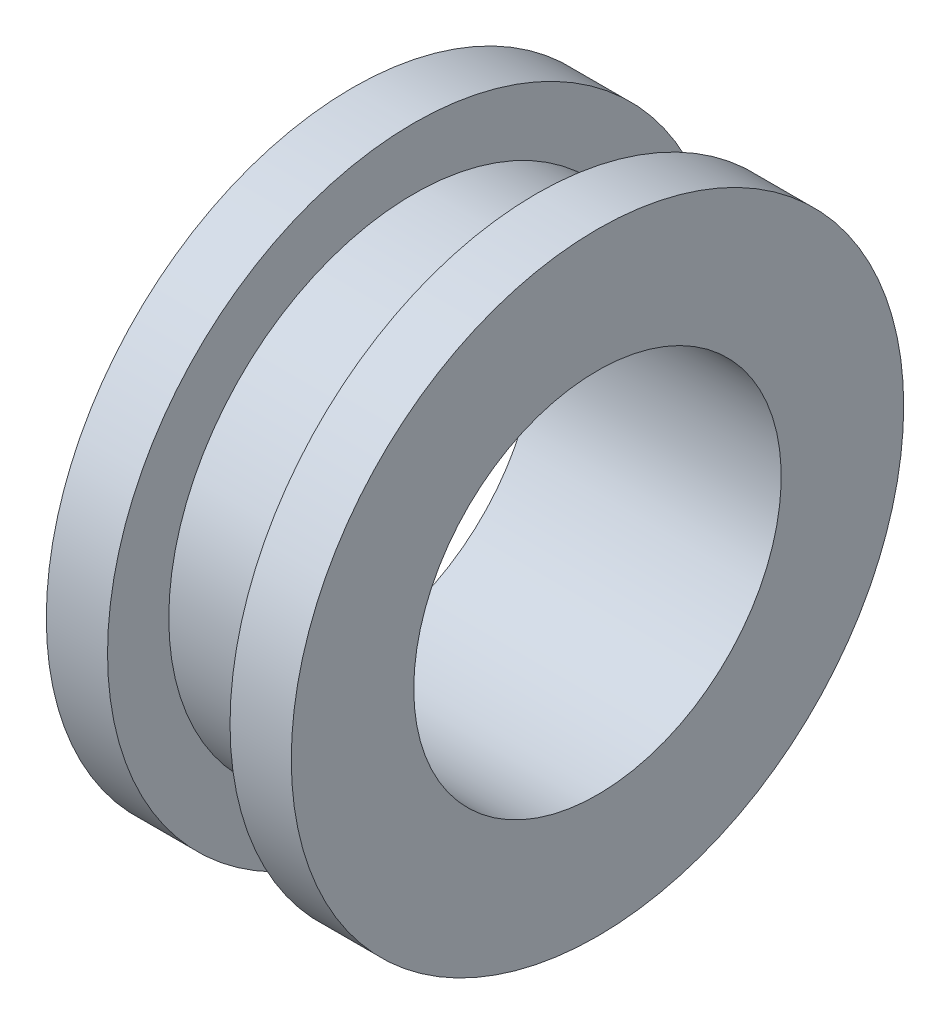
ISO-10303-21;
HEADER;
FILE_DESCRIPTION(('STEP AP214'),'2;1');
FILE_NAME('part.step','',(''),(''),'','','');
FILE_SCHEMA(('AUTOMOTIVE_DESIGN { 1 0 10303 214 1 1 1 1 }'));
ENDSEC;
DATA;
#1=APPLICATION_CONTEXT('core data for automotive mechanical design processes');
#2=APPLICATION_PROTOCOL_DEFINITION('international standard','automotive_design',2000,#1);
#3=PRODUCT_CONTEXT('',#1,'mechanical');
#4=PRODUCT('Part','Part','',(#3));
#5=PRODUCT_RELATED_PRODUCT_CATEGORY('part','',(#4));
#6=PRODUCT_DEFINITION_FORMATION('','',#4);
#7=PRODUCT_DEFINITION_CONTEXT('part definition',#1,'design');
#8=PRODUCT_DEFINITION('design','',#6,#7);
#9=PRODUCT_DEFINITION_SHAPE('','',#8);
#10=(LENGTH_UNIT() NAMED_UNIT(*) SI_UNIT(.MILLI.,.METRE.));
#11=(NAMED_UNIT(*) PLANE_ANGLE_UNIT() SI_UNIT($,.RADIAN.));
#12=(NAMED_UNIT(*) SI_UNIT($,.STERADIAN.) SOLID_ANGLE_UNIT());
#13=UNCERTAINTY_MEASURE_WITH_UNIT(LENGTH_MEASURE(1.E-05),#10,'distance_accuracy_value','');
#14=(GEOMETRIC_REPRESENTATION_CONTEXT(3) GLOBAL_UNCERTAINTY_ASSIGNED_CONTEXT((#13)) GLOBAL_UNIT_ASSIGNED_CONTEXT((#10,
#11,#12)) REPRESENTATION_CONTEXT('',''));
#15=CARTESIAN_POINT('',(0.,0.,0.));
#16=DIRECTION('',(0.,0.,1.));
#17=DIRECTION('',(1.,0.,0.));
#18=AXIS2_PLACEMENT_3D('',#15,#16,#17);
#19=CARTESIAN_POINT('',(0.,4.5,0.));
#20=DIRECTION('',(1.,0.,0.));
#21=DIRECTION('',(0.,0.,-1.));
#22=AXIS2_PLACEMENT_3D('',#19,#20,#21);
#23=PLANE('',#22);
#24=CARTESIAN_POINT('',(0.,0.,0.));
#25=DIRECTION('',(-1.,0.,0.));
#26=DIRECTION('',(0.,0.,1.));
#27=AXIS2_PLACEMENT_3D('',#24,#25,#26);
#28=CIRCLE('',#27,4.5);
#29=CARTESIAN_POINT('',(0.,0.,4.5));
#30=VERTEX_POINT('',#29);
#31=EDGE_CURVE('E59',#30,#30,#28,.T.);
#32=ORIENTED_EDGE('',*,*,#31,.F.);
#33=EDGE_LOOP('',(#32));
#34=FACE_BOUND('',#33,.T.);
#35=CARTESIAN_POINT('',(0.,0.,0.));
#36=DIRECTION('',(-1.,0.,0.));
#37=DIRECTION('',(0.,0.,1.));
#38=AXIS2_PLACEMENT_3D('',#35,#36,#37);
#39=CIRCLE('',#38,7.5);
#40=CARTESIAN_POINT('',(0.,0.,7.5));
#41=VERTEX_POINT('',#40);
#42=EDGE_CURVE('E10',#41,#41,#39,.T.);
#43=ORIENTED_EDGE('',*,*,#42,.T.);
#44=EDGE_LOOP('',(#43));
#45=FACE_BOUND('',#44,.T.);
#46=ADVANCED_FACE('F31',(#34,#45),#23,.F.);
#47=CARTESIAN_POINT('',(0.,0.,0.));
#48=DIRECTION('',(-1.,0.,0.));
#49=DIRECTION('',(0.,0.,1.));
#50=AXIS2_PLACEMENT_3D('',#47,#48,#49);
#51=CYLINDRICAL_SURFACE('',#50,7.5);
#52=ORIENTED_EDGE('',*,*,#42,.F.);
#53=EDGE_LOOP('',(#52));
#54=FACE_BOUND('',#53,.T.);
#55=CARTESIAN_POINT('',(1.5,0.,0.));
#56=DIRECTION('',(-1.,0.,0.));
#57=DIRECTION('',(0.,0.,1.));
#58=AXIS2_PLACEMENT_3D('',#55,#56,#57);
#59=CIRCLE('',#58,7.5);
#60=CARTESIAN_POINT('',(1.5,0.,7.5));
#61=VERTEX_POINT('',#60);
#62=EDGE_CURVE('E37',#61,#61,#59,.T.);
#63=ORIENTED_EDGE('',*,*,#62,.T.);
#64=EDGE_LOOP('',(#63));
#65=FACE_BOUND('',#64,.T.);
#66=ADVANCED_FACE('F66',(#54,#65),#51,.T.);
#67=CARTESIAN_POINT('',(1.5,7.5,0.));
#68=DIRECTION('',(-1.,0.,0.));
#69=DIRECTION('',(0.,0.,1.));
#70=AXIS2_PLACEMENT_3D('',#67,#68,#69);
#71=PLANE('',#70);
#72=ORIENTED_EDGE('',*,*,#62,.F.);
#73=EDGE_LOOP('',(#72));
#74=FACE_BOUND('',#73,.T.);
#75=CARTESIAN_POINT('',(1.5,0.,0.));
#76=DIRECTION('',(-1.,0.,0.));
#77=DIRECTION('',(0.,0.,1.));
#78=AXIS2_PLACEMENT_3D('',#75,#76,#77);
#79=CIRCLE('',#78,6.);
#80=CARTESIAN_POINT('',(1.5,0.,6.));
#81=VERTEX_POINT('',#80);
#82=EDGE_CURVE('E41',#81,#81,#79,.T.);
#83=ORIENTED_EDGE('',*,*,#82,.T.);
#84=EDGE_LOOP('',(#83));
#85=FACE_BOUND('',#84,.T.);
#86=ADVANCED_FACE('F70',(#74,#85),#71,.F.);
#87=CARTESIAN_POINT('',(0.,0.,0.));
#88=DIRECTION('',(-1.,0.,0.));
#89=DIRECTION('',(0.,0.,1.));
#90=AXIS2_PLACEMENT_3D('',#87,#88,#89);
#91=CYLINDRICAL_SURFACE('',#90,6.);
#92=ORIENTED_EDGE('',*,*,#82,.F.);
#93=EDGE_LOOP('',(#92));
#94=FACE_BOUND('',#93,.T.);
#95=CARTESIAN_POINT('',(4.5,0.,0.));
#96=DIRECTION('',(-1.,0.,0.));
#97=DIRECTION('',(0.,0.,1.));
#98=AXIS2_PLACEMENT_3D('',#95,#96,#97);
#99=CIRCLE('',#98,6.);
#100=CARTESIAN_POINT('',(4.5,0.,6.));
#101=VERTEX_POINT('',#100);
#102=EDGE_CURVE('E45',#101,#101,#99,.T.);
#103=ORIENTED_EDGE('',*,*,#102,.T.);
#104=EDGE_LOOP('',(#103));
#105=FACE_BOUND('',#104,.T.);
#106=ADVANCED_FACE('F75',(#94,#105),#91,.T.);
#107=CARTESIAN_POINT('',(4.5,7.5,0.));
#108=DIRECTION('',(1.,0.,0.));
#109=DIRECTION('',(0.,0.,-1.));
#110=AXIS2_PLACEMENT_3D('',#107,#108,#109);
#111=PLANE('',#110);
#112=ORIENTED_EDGE('',*,*,#102,.F.);
#113=EDGE_LOOP('',(#112));
#114=FACE_BOUND('',#113,.T.);
#115=CARTESIAN_POINT('',(4.5,0.,0.));
#116=DIRECTION('',(-1.,0.,0.));
#117=DIRECTION('',(0.,0.,1.));
#118=AXIS2_PLACEMENT_3D('',#115,#116,#117);
#119=CIRCLE('',#118,7.5);
#120=CARTESIAN_POINT('',(4.5,0.,7.5));
#121=VERTEX_POINT('',#120);
#122=EDGE_CURVE('E50',#121,#121,#119,.T.);
#123=ORIENTED_EDGE('',*,*,#122,.T.);
#124=EDGE_LOOP('',(#123));
#125=FACE_BOUND('',#124,.T.);
#126=ADVANCED_FACE('F81',(#114,#125),#111,.F.);
#127=CARTESIAN_POINT('',(0.,0.,0.));
#128=DIRECTION('',(-1.,0.,0.));
#129=DIRECTION('',(0.,0.,1.));
#130=AXIS2_PLACEMENT_3D('',#127,#128,#129);
#131=CYLINDRICAL_SURFACE('',#130,7.5);
#132=ORIENTED_EDGE('',*,*,#122,.F.);
#133=EDGE_LOOP('',(#132));
#134=FACE_BOUND('',#133,.T.);
#135=CARTESIAN_POINT('',(6.,0.,0.));
#136=DIRECTION('',(-1.,0.,0.));
#137=DIRECTION('',(0.,0.,1.));
#138=AXIS2_PLACEMENT_3D('',#135,#136,#137);
#139=CIRCLE('',#138,7.5);
#140=CARTESIAN_POINT('',(6.,0.,7.5));
#141=VERTEX_POINT('',#140);
#142=EDGE_CURVE('E53',#141,#141,#139,.T.);
#143=ORIENTED_EDGE('',*,*,#142,.T.);
#144=EDGE_LOOP('',(#143));
#145=FACE_BOUND('',#144,.T.);
#146=ADVANCED_FACE('F85',(#134,#145),#131,.T.);
#147=CARTESIAN_POINT('',(6.,4.5,0.));
#148=DIRECTION('',(-1.,0.,0.));
#149=DIRECTION('',(0.,0.,1.));
#150=AXIS2_PLACEMENT_3D('',#147,#148,#149);
#151=PLANE('',#150);
#152=ORIENTED_EDGE('',*,*,#142,.F.);
#153=EDGE_LOOP('',(#152));
#154=FACE_BOUND('',#153,.T.);
#155=CARTESIAN_POINT('',(6.,0.,0.));
#156=DIRECTION('',(-1.,0.,0.));
#157=DIRECTION('',(0.,0.,1.));
#158=AXIS2_PLACEMENT_3D('',#155,#156,#157);
#159=CIRCLE('',#158,4.5);
#160=CARTESIAN_POINT('',(6.,0.,4.5));
#161=VERTEX_POINT('',#160);
#162=EDGE_CURVE('E56',#161,#161,#159,.T.);
#163=ORIENTED_EDGE('',*,*,#162,.T.);
#164=EDGE_LOOP('',(#163));
#165=FACE_BOUND('',#164,.T.);
#166=ADVANCED_FACE('F89',(#154,#165),#151,.F.);
#167=CARTESIAN_POINT('',(0.,0.,0.));
#168=DIRECTION('',(-1.,0.,0.));
#169=DIRECTION('',(0.,0.,1.));
#170=AXIS2_PLACEMENT_3D('',#167,#168,#169);
#171=CYLINDRICAL_SURFACE('',#170,4.5);
#172=ORIENTED_EDGE('',*,*,#162,.F.);
#173=EDGE_LOOP('',(#172));
#174=FACE_BOUND('',#173,.T.);
#175=ORIENTED_EDGE('',*,*,#31,.T.);
#176=EDGE_LOOP('',(#175));
#177=FACE_BOUND('',#176,.T.);
#178=ADVANCED_FACE('F63',(#174,#177),#171,.F.);
#179=CLOSED_SHELL('',(#46,#66,#86,#106,#126,#146,#166,#178));
#180=MANIFOLD_SOLID_BREP('B2',#179);
#181=ADVANCED_BREP_SHAPE_REPRESENTATION('',(#18,#180),#14);
#182=SHAPE_DEFINITION_REPRESENTATION(#9,#181);
ENDSEC;
END-ISO-10303-21;
